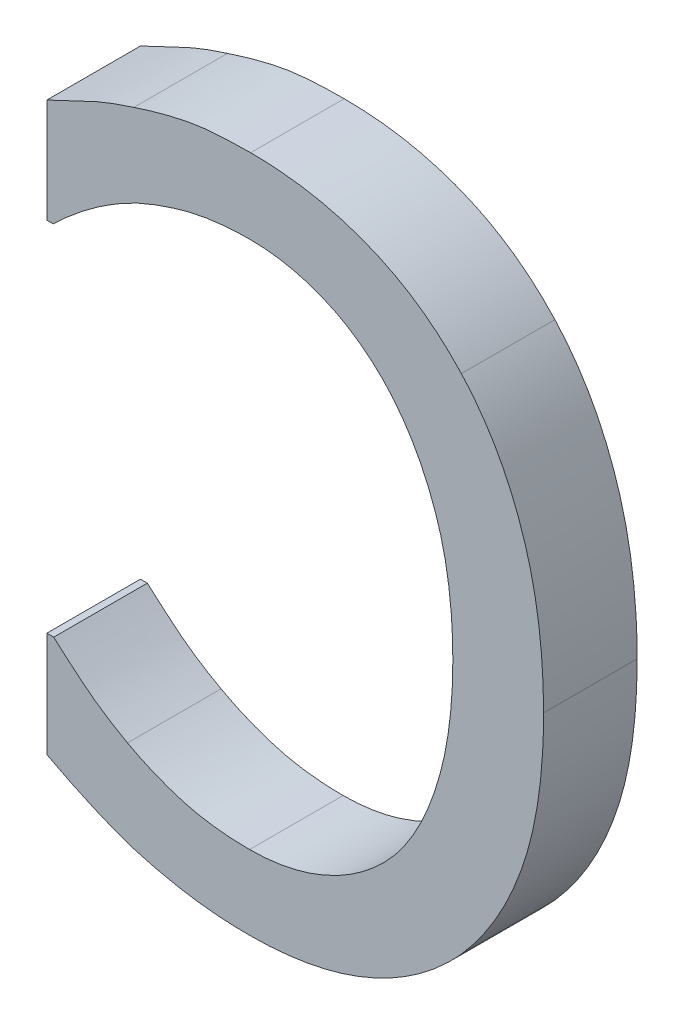
ISO-10303-21;
HEADER;
FILE_DESCRIPTION(('STEP AP214'),'2;1');
FILE_NAME('part.step','',(''),(''),'','','');
FILE_SCHEMA(('AUTOMOTIVE_DESIGN { 1 0 10303 214 1 1 1 1 }'));
ENDSEC;
DATA;
#1=APPLICATION_CONTEXT('core data for automotive mechanical design processes');
#2=APPLICATION_PROTOCOL_DEFINITION('international standard','automotive_design',2000,#1);
#3=PRODUCT_CONTEXT('',#1,'mechanical');
#4=PRODUCT('Part','Part','',(#3));
#5=PRODUCT_RELATED_PRODUCT_CATEGORY('part','',(#4));
#6=PRODUCT_DEFINITION_FORMATION('','',#4);
#7=PRODUCT_DEFINITION_CONTEXT('part definition',#1,'design');
#8=PRODUCT_DEFINITION('design','',#6,#7);
#9=PRODUCT_DEFINITION_SHAPE('','',#8);
#10=(LENGTH_UNIT() NAMED_UNIT(*) SI_UNIT(.MILLI.,.METRE.));
#11=(NAMED_UNIT(*) PLANE_ANGLE_UNIT() SI_UNIT($,.RADIAN.));
#12=(NAMED_UNIT(*) SI_UNIT($,.STERADIAN.) SOLID_ANGLE_UNIT());
#13=UNCERTAINTY_MEASURE_WITH_UNIT(LENGTH_MEASURE(1.E-05),#10,'distance_accuracy_value','');
#14=(GEOMETRIC_REPRESENTATION_CONTEXT(3) GLOBAL_UNCERTAINTY_ASSIGNED_CONTEXT((#13)) GLOBAL_UNIT_ASSIGNED_CONTEXT((#10,
#11,#12)) REPRESENTATION_CONTEXT('',''));
#15=CARTESIAN_POINT('',(0.,0.,0.));
#16=DIRECTION('',(0.,0.,1.));
#17=DIRECTION('',(1.,0.,0.));
#18=AXIS2_PLACEMENT_3D('',#15,#16,#17);
#19=CARTESIAN_POINT('',(1.253187687147,0.93501124365464,0.));
#20=CARTESIAN_POINT('',(1.253187687147,0.93501124365464,0.1));
#21=CARTESIAN_POINT('',(1.253187687147,1.023483728328,0.));
#22=CARTESIAN_POINT('',(1.253187687147,1.023483728328,0.1));
#23=CARTESIAN_POINT('',(1.207250050874,1.159595243209,0.));
#24=CARTESIAN_POINT('',(1.207250050874,1.159595243209,0.1));
#25=CARTESIAN_POINT('',(1.165282333786,1.204965748169,0.));
#26=CARTESIAN_POINT('',(1.165282333786,1.204965748169,0.1));
#27=B_SPLINE_SURFACE_WITH_KNOTS('',2,1,((#19,#20),(#21,#22),(#23,#24),(#25,#26)),.UNSPECIFIED.,
.F.,.F.,.F.,(3,1,3),(2,2),(-2.,-1.,0.),(0.,0.01),.UNSPECIFIED.);
#28=CARTESIAN_POINT('',(1.165282333786,1.204965748169,0.));
#29=CARTESIAN_POINT('',(1.207250050874,1.159595243209,0.));
#30=CARTESIAN_POINT('',(1.253187687147,1.023483728328,0.));
#31=CARTESIAN_POINT('',(1.253187687147,0.93501124365464,0.));
#32=B_SPLINE_CURVE_WITH_KNOTS('',2,(#28,#29,#30,#31),.UNSPECIFIED.,.F.,.F.,(3,1,3),(0.,1.,2.),.UNSPECIFIED.);
#33=CARTESIAN_POINT('',(1.165282333786,1.204965748169,0.));
#34=VERTEX_POINT('',#33);
#35=CARTESIAN_POINT('',(1.253187687147,0.93501124365464,0.));
#36=VERTEX_POINT('',#35);
#37=EDGE_CURVE('E11',#34,#36,#32,.T.);
#38=DIRECTION('',(0.,0.,1.));
#39=VECTOR('',#38,1.);
#40=CARTESIAN_POINT('',(1.165282333786,1.204965748169,0.));
#41=LINE('',#40,#39);
#42=CARTESIAN_POINT('',(1.165282333786,1.204965748169,0.1));
#43=VERTEX_POINT('',#42);
#44=EDGE_CURVE('E28',#34,#43,#41,.T.);
#45=CARTESIAN_POINT('',(1.253187687147,0.93501124365464,0.1));
#46=CARTESIAN_POINT('',(1.253187687147,1.023483728328,0.1));
#47=CARTESIAN_POINT('',(1.207250050874,1.159595243209,0.1));
#48=CARTESIAN_POINT('',(1.165282333786,1.204965748169,0.1));
#49=B_SPLINE_CURVE_WITH_KNOTS('',2,(#45,#46,#47,#48),.UNSPECIFIED.,.F.,.F.,(3,1,3),(-2.,-1.,0.),.UNSPECIFIED.);
#50=CARTESIAN_POINT('',(1.253187687147,0.93501124365464,0.1));
#51=VERTEX_POINT('',#50);
#52=EDGE_CURVE('E176',#51,#43,#49,.T.);
#53=DIRECTION('',(0.,0.,1.));
#54=VECTOR('',#53,1.);
#55=CARTESIAN_POINT('',(1.253187687147,0.93501124365464,0.));
#56=LINE('',#55,#54);
#57=EDGE_CURVE('E460',#36,#51,#56,.T.);
#58=ORIENTED_EDGE('',*,*,#37,.F.);
#59=ORIENTED_EDGE('',*,*,#44,.T.);
#60=ORIENTED_EDGE('',*,*,#52,.F.);
#61=ORIENTED_EDGE('',*,*,#57,.F.);
#62=EDGE_LOOP('',(#58,#59,#60,#61));
#63=FACE_BOUND('',#62,.T.);
#64=ADVANCED_FACE('F17',(#63),#27,.T.);
#65=CARTESIAN_POINT('',(1.165849465098,0.668459527012044,0.));
#66=CARTESIAN_POINT('',(1.165849465098,0.668459527012044,0.1));
#67=CARTESIAN_POINT('',(1.208384313498,0.716665688532513,0.));
#68=CARTESIAN_POINT('',(1.208384313498,0.716665688532513,0.1));
#69=CARTESIAN_POINT('',(1.253187687147,0.847105890293784,0.));
#70=CARTESIAN_POINT('',(1.253187687147,0.847105890293784,0.1));
#71=CARTESIAN_POINT('',(1.253187687147,0.93501124365464,0.));
#72=CARTESIAN_POINT('',(1.253187687147,0.93501124365464,0.1));
#73=B_SPLINE_SURFACE_WITH_KNOTS('',2,1,((#65,#66),(#67,#68),(#69,#70),(#71,#72)),.UNSPECIFIED.,
.F.,.F.,.F.,(3,1,3),(2,2),(-2.,-1.,0.),(0.,0.01),.UNSPECIFIED.);
#74=CARTESIAN_POINT('',(1.253187687147,0.93501124365464,0.));
#75=CARTESIAN_POINT('',(1.253187687147,0.847105890293784,0.));
#76=CARTESIAN_POINT('',(1.208384313498,0.716665688532513,0.));
#77=CARTESIAN_POINT('',(1.165849465098,0.668459527012044,0.));
#78=B_SPLINE_CURVE_WITH_KNOTS('',2,(#74,#75,#76,#77),.UNSPECIFIED.,.F.,.F.,(3,1,3),(0.,1.,2.),.UNSPECIFIED.);
#79=CARTESIAN_POINT('',(1.165849465098,0.668459527012044,0.));
#80=VERTEX_POINT('',#79);
#81=EDGE_CURVE('E453',#36,#80,#78,.T.);
#82=CARTESIAN_POINT('',(1.165849465098,0.668459527012044,0.1));
#83=CARTESIAN_POINT('',(1.208384313498,0.716665688532513,0.1));
#84=CARTESIAN_POINT('',(1.253187687147,0.847105890293784,0.1));
#85=CARTESIAN_POINT('',(1.253187687147,0.93501124365464,0.1));
#86=B_SPLINE_CURVE_WITH_KNOTS('',2,(#82,#83,#84,#85),.UNSPECIFIED.,.F.,.F.,(3,1,3),(-2.,-1.,0.),.UNSPECIFIED.);
#87=CARTESIAN_POINT('',(1.165849465098,0.668459527012044,0.1));
#88=VERTEX_POINT('',#87);
#89=EDGE_CURVE('E449',#88,#51,#86,.T.);
#90=DIRECTION('',(0.,0.,1.));
#91=VECTOR('',#90,1.);
#92=CARTESIAN_POINT('',(1.165849465098,0.668459527012044,0.));
#93=LINE('',#92,#91);
#94=EDGE_CURVE('E443',#80,#88,#93,.T.);
#95=ORIENTED_EDGE('',*,*,#81,.F.);
#96=ORIENTED_EDGE('',*,*,#57,.T.);
#97=ORIENTED_EDGE('',*,*,#89,.F.);
#98=ORIENTED_EDGE('',*,*,#94,.F.);
#99=EDGE_LOOP('',(#95,#96,#97,#98));
#100=FACE_BOUND('',#99,.T.);
#101=ADVANCED_FACE('F538',(#100),#73,.T.);
#102=CARTESIAN_POINT('',(0.938429808983811,0.572047203971105,0.));
#103=CARTESIAN_POINT('',(0.938429808983811,0.572047203971105,0.1));
#104=CARTESIAN_POINT('',(1.009321222985,0.572047203971105,0.));
#105=CARTESIAN_POINT('',(1.009321222985,0.572047203971105,0.1));
#106=CARTESIAN_POINT('',(1.12388174801,0.621387628115585,0.));
#107=CARTESIAN_POINT('',(1.12388174801,0.621387628115585,0.1));
#108=CARTESIAN_POINT('',(1.165849465098,0.668459527012044,0.));
#109=CARTESIAN_POINT('',(1.165849465098,0.668459527012044,0.1));
#110=B_SPLINE_SURFACE_WITH_KNOTS('',2,1,((#102,#103),(#104,#105),(#106,#107),(#108,#109)),
.UNSPECIFIED.,.F.,.F.,.F.,(3,1,3),(2,2),(-2.,-1.,0.),(0.,0.01),.UNSPECIFIED.);
#111=CARTESIAN_POINT('',(1.165849465098,0.668459527012044,0.));
#112=CARTESIAN_POINT('',(1.12388174801,0.621387628115585,0.));
#113=CARTESIAN_POINT('',(1.009321222985,0.572047203971105,0.));
#114=CARTESIAN_POINT('',(0.938429808983811,0.572047203971105,0.));
#115=B_SPLINE_CURVE_WITH_KNOTS('',2,(#111,#112,#113,#114),.UNSPECIFIED.,.F.,.F.,(3,1,3),(0.,1.,
2.),.UNSPECIFIED.);
#116=CARTESIAN_POINT('',(0.938429808983811,0.572047203971105,0.));
#117=VERTEX_POINT('',#116);
#118=EDGE_CURVE('E436',#80,#117,#115,.T.);
#119=CARTESIAN_POINT('',(0.938429808983811,0.572047203971105,0.1));
#120=CARTESIAN_POINT('',(1.009321222985,0.572047203971105,0.1));
#121=CARTESIAN_POINT('',(1.12388174801,0.621387628115585,0.1));
#122=CARTESIAN_POINT('',(1.165849465098,0.668459527012044,0.1));
#123=B_SPLINE_CURVE_WITH_KNOTS('',2,(#119,#120,#121,#122),.UNSPECIFIED.,.F.,.F.,(3,1,3),(-2.,
-1.,0.),.UNSPECIFIED.);
#124=CARTESIAN_POINT('',(0.938429808983811,0.572047203971105,0.1));
#125=VERTEX_POINT('',#124);
#126=EDGE_CURVE('E431',#125,#88,#123,.T.);
#127=DIRECTION('',(0.,0.,1.));
#128=VECTOR('',#127,1.);
#129=CARTESIAN_POINT('',(0.938429808983811,0.572047203971105,0.));
#130=LINE('',#129,#128);
#131=EDGE_CURVE('E425',#117,#125,#130,.T.);
#132=ORIENTED_EDGE('',*,*,#118,.F.);
#133=ORIENTED_EDGE('',*,*,#94,.T.);
#134=ORIENTED_EDGE('',*,*,#126,.F.);
#135=ORIENTED_EDGE('',*,*,#131,.F.);
#136=EDGE_LOOP('',(#132,#133,#134,#135));
#137=FACE_BOUND('',#136,.T.);
#138=ADVANCED_FACE('F534',(#137),#110,.T.);
#139=CARTESIAN_POINT('',(0.815362314278612,0.590195405955281,0.));
#140=CARTESIAN_POINT('',(0.815362314278612,0.590195405955281,0.1));
#141=CARTESIAN_POINT('',(0.841450354630866,0.582255567587204,0.));
#142=CARTESIAN_POINT('',(0.841450354630866,0.582255567587204,0.1));
#143=CARTESIAN_POINT('',(0.903267667639468,0.572047203971105,0.));
#144=CARTESIAN_POINT('',(0.903267667639468,0.572047203971105,0.1));
#145=CARTESIAN_POINT('',(0.938429808983811,0.572047203971105,0.));
#146=CARTESIAN_POINT('',(0.938429808983811,0.572047203971105,0.1));
#147=B_SPLINE_SURFACE_WITH_KNOTS('',2,1,((#139,#140),(#141,#142),(#143,#144),(#145,#146)),
.UNSPECIFIED.,.F.,.F.,.F.,(3,1,3),(2,2),(-2.,-1.,0.),(0.,0.01),.UNSPECIFIED.);
#148=CARTESIAN_POINT('',(0.938429808983811,0.572047203971105,0.));
#149=CARTESIAN_POINT('',(0.903267667639468,0.572047203971105,0.));
#150=CARTESIAN_POINT('',(0.841450354630866,0.582255567587204,0.));
#151=CARTESIAN_POINT('',(0.815362314278612,0.590195405955281,0.));
#152=B_SPLINE_CURVE_WITH_KNOTS('',2,(#148,#149,#150,#151),.UNSPECIFIED.,.F.,.F.,(3,1,3),(0.,1.,
2.),.UNSPECIFIED.);
#153=CARTESIAN_POINT('',(0.815362314278612,0.590195405955281,0.));
#154=VERTEX_POINT('',#153);
#155=EDGE_CURVE('E418',#117,#154,#152,.T.);
#156=CARTESIAN_POINT('',(0.815362314278612,0.590195405955281,0.1));
#157=CARTESIAN_POINT('',(0.841450354630866,0.582255567587204,0.1));
#158=CARTESIAN_POINT('',(0.903267667639468,0.572047203971105,0.1));
#159=CARTESIAN_POINT('',(0.938429808983811,0.572047203971105,0.1));
#160=B_SPLINE_CURVE_WITH_KNOTS('',2,(#156,#157,#158,#159),.UNSPECIFIED.,.F.,.F.,(3,1,3),(-2.,
-1.,0.),.UNSPECIFIED.);
#161=CARTESIAN_POINT('',(0.815362314278612,0.590195405955281,0.1));
#162=VERTEX_POINT('',#161);
#163=EDGE_CURVE('E413',#162,#125,#160,.T.);
#164=DIRECTION('',(0.,0.,1.));
#165=VECTOR('',#164,1.);
#166=CARTESIAN_POINT('',(0.815362314278612,0.590195405955281,0.));
#167=LINE('',#166,#165);
#168=EDGE_CURVE('E407',#154,#162,#167,.T.);
#169=ORIENTED_EDGE('',*,*,#155,.F.);
#170=ORIENTED_EDGE('',*,*,#131,.T.);
#171=ORIENTED_EDGE('',*,*,#163,.F.);
#172=ORIENTED_EDGE('',*,*,#168,.F.);
#173=EDGE_LOOP('',(#169,#170,#171,#172));
#174=FACE_BOUND('',#173,.T.);
#175=ADVANCED_FACE('F530',(#174),#147,.T.);
#176=CARTESIAN_POINT('',(0.722352779109706,0.631028860419679,0.));
#177=CARTESIAN_POINT('',(0.722352779109706,0.631028860419679,0.1));
#178=CARTESIAN_POINT('',(0.745605162901933,0.618551971555557,0.));
#179=CARTESIAN_POINT('',(0.745605162901933,0.618551971555557,0.1));
#180=CARTESIAN_POINT('',(0.792677061798391,0.597568113011353,0.));
#181=CARTESIAN_POINT('',(0.792677061798391,0.597568113011353,0.1));
#182=CARTESIAN_POINT('',(0.815362314278612,0.590195405955281,0.));
#183=CARTESIAN_POINT('',(0.815362314278612,0.590195405955281,0.1));
#184=B_SPLINE_SURFACE_WITH_KNOTS('',2,1,((#176,#177),(#178,#179),(#180,#181),(#182,#183)),
.UNSPECIFIED.,.F.,.F.,.F.,(3,1,3),(2,2),(-2.,-1.,0.),(0.,0.01),.UNSPECIFIED.);
#185=CARTESIAN_POINT('',(0.815362314278612,0.590195405955281,0.));
#186=CARTESIAN_POINT('',(0.792677061798391,0.597568113011353,0.));
#187=CARTESIAN_POINT('',(0.745605162901933,0.618551971555557,0.));
#188=CARTESIAN_POINT('',(0.722352779109706,0.631028860419679,0.));
#189=B_SPLINE_CURVE_WITH_KNOTS('',2,(#185,#186,#187,#188),.UNSPECIFIED.,.F.,.F.,(3,1,3),(0.,1.,
2.),.UNSPECIFIED.);
#190=CARTESIAN_POINT('',(0.722352779109706,0.631028860419679,0.));
#191=VERTEX_POINT('',#190);
#192=EDGE_CURVE('E400',#154,#191,#189,.T.);
#193=CARTESIAN_POINT('',(0.722352779109706,0.631028860419679,0.1));
#194=CARTESIAN_POINT('',(0.745605162901933,0.618551971555557,0.1));
#195=CARTESIAN_POINT('',(0.792677061798391,0.597568113011353,0.1));
#196=CARTESIAN_POINT('',(0.815362314278612,0.590195405955281,0.1));
#197=B_SPLINE_CURVE_WITH_KNOTS('',2,(#193,#194,#195,#196),.UNSPECIFIED.,.F.,.F.,(3,1,3),(-2.,
-1.,0.),.UNSPECIFIED.);
#198=CARTESIAN_POINT('',(0.722352779109706,0.631028860419679,0.1));
#199=VERTEX_POINT('',#198);
#200=EDGE_CURVE('E395',#199,#162,#197,.T.);
#201=DIRECTION('',(0.,0.,1.));
#202=VECTOR('',#201,1.);
#203=CARTESIAN_POINT('',(0.722352779109706,0.631028860419679,0.));
#204=LINE('',#203,#202);
#205=EDGE_CURVE('E392',#191,#199,#204,.T.);
#206=ORIENTED_EDGE('',*,*,#192,.F.);
#207=ORIENTED_EDGE('',*,*,#168,.T.);
#208=ORIENTED_EDGE('',*,*,#200,.F.);
#209=ORIENTED_EDGE('',*,*,#205,.F.);
#210=EDGE_LOOP('',(#206,#207,#208,#209));
#211=FACE_BOUND('',#210,.T.);
#212=ADVANCED_FACE('F526',(#211),#184,.T.);
#213=CARTESIAN_POINT('',(0.722352779109706,0.743320860196773,0.));
#214=DIRECTION('',(-1.,0.,0.));
#215=DIRECTION('',(0.,-1.,0.));
#216=AXIS2_PLACEMENT_3D('',#213,#214,#215);
#217=PLANE('',#216);
#218=DIRECTION('',(0.,1.,0.));
#219=VECTOR('',#218,1.);
#220=CARTESIAN_POINT('',(0.722352779109706,0.631028860419679,0.));
#221=LINE('',#220,#219);
#222=CARTESIAN_POINT('',(0.722352779109706,0.743320860196773,0.));
#223=VERTEX_POINT('',#222);
#224=EDGE_CURVE('E390',#191,#223,#221,.T.);
#225=ORIENTED_EDGE('',*,*,#224,.F.);
#226=ORIENTED_EDGE('',*,*,#205,.T.);
#227=DIRECTION('',(0.,-1.,0.));
#228=VECTOR('',#227,1.);
#229=CARTESIAN_POINT('',(0.722352779109706,0.631028860419679,0.1));
#230=LINE('',#229,#228);
#231=CARTESIAN_POINT('',(0.722352779109706,0.743320860196773,0.1));
#232=VERTEX_POINT('',#231);
#233=EDGE_CURVE('E387',#232,#199,#230,.T.);
#234=ORIENTED_EDGE('',*,*,#233,.F.);
#235=DIRECTION('',(0.,0.,1.));
#236=VECTOR('',#235,1.);
#237=CARTESIAN_POINT('',(0.722352779109706,0.743320860196773,0.));
#238=LINE('',#237,#236);
#239=EDGE_CURVE('E384',#223,#232,#238,.T.);
#240=ORIENTED_EDGE('',*,*,#239,.F.);
#241=EDGE_LOOP('',(#225,#226,#234,#240));
#242=FACE_BOUND('',#241,.T.);
#243=ADVANCED_FACE('F522',(#242),#217,.T.);
#244=CARTESIAN_POINT('',(0.729725486165778,0.743320860196773,0.));
#245=DIRECTION('',(0.,1.,0.));
#246=DIRECTION('',(-1.,0.,0.));
#247=AXIS2_PLACEMENT_3D('',#244,#245,#246);
#248=PLANE('',#247);
#249=DIRECTION('',(1.,0.,0.));
#250=VECTOR('',#249,1.);
#251=CARTESIAN_POINT('',(0.722352779109706,0.743320860196773,0.));
#252=LINE('',#251,#250);
#253=CARTESIAN_POINT('',(0.729725486165778,0.743320860196773,0.));
#254=VERTEX_POINT('',#253);
#255=EDGE_CURVE('E382',#223,#254,#252,.T.);
#256=ORIENTED_EDGE('',*,*,#255,.F.);
#257=ORIENTED_EDGE('',*,*,#239,.T.);
#258=DIRECTION('',(-1.,0.,0.));
#259=VECTOR('',#258,1.);
#260=CARTESIAN_POINT('',(0.722352779109706,0.743320860196773,0.1));
#261=LINE('',#260,#259);
#262=CARTESIAN_POINT('',(0.729725486165778,0.743320860196773,0.1));
#263=VERTEX_POINT('',#262);
#264=EDGE_CURVE('E379',#263,#232,#261,.T.);
#265=ORIENTED_EDGE('',*,*,#264,.F.);
#266=DIRECTION('',(0.,0.,1.));
#267=VECTOR('',#266,1.);
#268=CARTESIAN_POINT('',(0.729725486165778,0.743320860196773,0.));
#269=LINE('',#268,#267);
#270=EDGE_CURVE('E373',#254,#263,#269,.T.);
#271=ORIENTED_EDGE('',*,*,#270,.F.);
#272=EDGE_LOOP('',(#256,#257,#265,#271));
#273=FACE_BOUND('',#272,.T.);
#274=ADVANCED_FACE('F518',(#273),#248,.T.);
#275=CARTESIAN_POINT('',(0.808556738534546,0.684906335060204,0.));
#276=CARTESIAN_POINT('',(0.808556738534546,0.684906335060204,0.1));
#277=CARTESIAN_POINT('',(0.780767304246275,0.700218880484353,0.));
#278=CARTESIAN_POINT('',(0.780767304246275,0.700218880484353,0.1));
#279=CARTESIAN_POINT('',(0.7422023750299,0.731978233956662,0.));
#280=CARTESIAN_POINT('',(0.7422023750299,0.731978233956662,0.1));
#281=CARTESIAN_POINT('',(0.729725486165778,0.743320860196773,0.));
#282=CARTESIAN_POINT('',(0.729725486165778,0.743320860196773,0.1));
#283=B_SPLINE_SURFACE_WITH_KNOTS('',2,1,((#275,#276),(#277,#278),(#279,#280),(#281,#282)),
.UNSPECIFIED.,.F.,.F.,.F.,(3,1,3),(2,2),(-2.,-1.,0.),(0.,0.01),.UNSPECIFIED.);
#284=CARTESIAN_POINT('',(0.729725486165778,0.743320860196773,0.));
#285=CARTESIAN_POINT('',(0.7422023750299,0.731978233956662,0.));
#286=CARTESIAN_POINT('',(0.780767304246275,0.700218880484353,0.));
#287=CARTESIAN_POINT('',(0.808556738534546,0.684906335060204,0.));
#288=B_SPLINE_CURVE_WITH_KNOTS('',2,(#284,#285,#286,#287),.UNSPECIFIED.,.F.,.F.,(3,1,3),(0.,1.,
2.),.UNSPECIFIED.);
#289=CARTESIAN_POINT('',(0.808556738534546,0.684906335060204,0.));
#290=VERTEX_POINT('',#289);
#291=EDGE_CURVE('E366',#254,#290,#288,.T.);
#292=CARTESIAN_POINT('',(0.808556738534546,0.684906335060204,0.1));
#293=CARTESIAN_POINT('',(0.780767304246275,0.700218880484353,0.1));
#294=CARTESIAN_POINT('',(0.7422023750299,0.731978233956662,0.1));
#295=CARTESIAN_POINT('',(0.729725486165778,0.743320860196773,0.1));
#296=B_SPLINE_CURVE_WITH_KNOTS('',2,(#292,#293,#294,#295),.UNSPECIFIED.,.F.,.F.,(3,1,3),(-2.,
-1.,0.),.UNSPECIFIED.);
#297=CARTESIAN_POINT('',(0.808556738534546,0.684906335060204,0.1));
#298=VERTEX_POINT('',#297);
#299=EDGE_CURVE('E361',#298,#263,#296,.T.);
#300=DIRECTION('',(0.,0.,1.));
#301=VECTOR('',#300,1.);
#302=CARTESIAN_POINT('',(0.808556738534546,0.684906335060204,0.));
#303=LINE('',#302,#301);
#304=EDGE_CURVE('E355',#290,#298,#303,.T.);
#305=ORIENTED_EDGE('',*,*,#291,.F.);
#306=ORIENTED_EDGE('',*,*,#270,.T.);
#307=ORIENTED_EDGE('',*,*,#299,.F.);
#308=ORIENTED_EDGE('',*,*,#304,.F.);
#309=EDGE_LOOP('',(#305,#306,#307,#308));
#310=FACE_BOUND('',#309,.T.);
#311=ADVANCED_FACE('F514',(#310),#283,.T.);
#312=CARTESIAN_POINT('',(0.938996940295816,0.651445587651878,0.));
#313=CARTESIAN_POINT('',(0.938996940295816,0.651445587651878,0.1));
#314=CARTESIAN_POINT('',(0.898163485831419,0.651445587651878,0.));
#315=CARTESIAN_POINT('',(0.898163485831419,0.651445587651878,0.1));
#316=CARTESIAN_POINT('',(0.835211910198806,0.67016092094806,0.));
#317=CARTESIAN_POINT('',(0.835211910198806,0.67016092094806,0.1));
#318=CARTESIAN_POINT('',(0.808556738534546,0.684906335060204,0.));
#319=CARTESIAN_POINT('',(0.808556738534546,0.684906335060204,0.1));
#320=B_SPLINE_SURFACE_WITH_KNOTS('',2,1,((#312,#313),(#314,#315),(#316,#317),(#318,#319)),
.UNSPECIFIED.,.F.,.F.,.F.,(3,1,3),(2,2),(-2.,-1.,0.),(0.,0.01),.UNSPECIFIED.);
#321=CARTESIAN_POINT('',(0.808556738534546,0.684906335060204,0.));
#322=CARTESIAN_POINT('',(0.835211910198806,0.67016092094806,0.));
#323=CARTESIAN_POINT('',(0.898163485831419,0.651445587651878,0.));
#324=CARTESIAN_POINT('',(0.938996940295816,0.651445587651878,0.));
#325=B_SPLINE_CURVE_WITH_KNOTS('',2,(#321,#322,#323,#324),.UNSPECIFIED.,.F.,.F.,(3,1,3),(0.,1.,
2.),.UNSPECIFIED.);
#326=CARTESIAN_POINT('',(0.938996940295816,0.651445587651878,0.));
#327=VERTEX_POINT('',#326);
#328=EDGE_CURVE('E348',#290,#327,#325,.T.);
#329=CARTESIAN_POINT('',(0.938996940295816,0.651445587651878,0.1));
#330=CARTESIAN_POINT('',(0.898163485831419,0.651445587651878,0.1));
#331=CARTESIAN_POINT('',(0.835211910198806,0.67016092094806,0.1));
#332=CARTESIAN_POINT('',(0.808556738534546,0.684906335060204,0.1));
#333=B_SPLINE_CURVE_WITH_KNOTS('',2,(#329,#330,#331,#332),.UNSPECIFIED.,.F.,.F.,(3,1,3),(-2.,
-1.,0.),.UNSPECIFIED.);
#334=CARTESIAN_POINT('',(0.938996940295816,0.651445587651878,0.1));
#335=VERTEX_POINT('',#334);
#336=EDGE_CURVE('E343',#335,#298,#333,.T.);
#337=DIRECTION('',(0.,0.,1.));
#338=VECTOR('',#337,1.);
#339=CARTESIAN_POINT('',(0.938996940295816,0.651445587651878,0.));
#340=LINE('',#339,#338);
#341=EDGE_CURVE('E337',#327,#335,#340,.T.);
#342=ORIENTED_EDGE('',*,*,#328,.F.);
#343=ORIENTED_EDGE('',*,*,#304,.T.);
#344=ORIENTED_EDGE('',*,*,#336,.F.);
#345=ORIENTED_EDGE('',*,*,#341,.F.);
#346=EDGE_LOOP('',(#342,#343,#344,#345));
#347=FACE_BOUND('',#346,.T.);
#348=ADVANCED_FACE('F510',(#347),#320,.T.);
#349=CARTESIAN_POINT('',(1.093823788473,0.723471264276579,0.));
#350=CARTESIAN_POINT('',(1.093823788473,0.723471264276579,0.1));
#351=CARTESIAN_POINT('',(1.063765828937,0.688309122932237,0.));
#352=CARTESIAN_POINT('',(1.063765828937,0.688309122932237,0.1));
#353=CARTESIAN_POINT('',(0.983800313944253,0.651445587651878,0.));
#354=CARTESIAN_POINT('',(0.983800313944253,0.651445587651878,0.1));
#355=CARTESIAN_POINT('',(0.938996940295816,0.651445587651878,0.));
#356=CARTESIAN_POINT('',(0.938996940295816,0.651445587651878,0.1));
#357=B_SPLINE_SURFACE_WITH_KNOTS('',2,1,((#349,#350),(#351,#352),(#353,#354),(#355,#356)),
.UNSPECIFIED.,.F.,.F.,.F.,(3,1,3),(2,2),(-2.,-1.,0.),(0.,0.01),.UNSPECIFIED.);
#358=CARTESIAN_POINT('',(0.938996940295816,0.651445587651878,0.));
#359=CARTESIAN_POINT('',(0.983800313944253,0.651445587651878,0.));
#360=CARTESIAN_POINT('',(1.063765828937,0.688309122932237,0.));
#361=CARTESIAN_POINT('',(1.093823788473,0.723471264276579,0.));
#362=B_SPLINE_CURVE_WITH_KNOTS('',2,(#358,#359,#360,#361),.UNSPECIFIED.,.F.,.F.,(3,1,3),(0.,1.,
2.),.UNSPECIFIED.);
#363=CARTESIAN_POINT('',(1.093823788473,0.723471264276579,0.));
#364=VERTEX_POINT('',#363);
#365=EDGE_CURVE('E330',#327,#364,#362,.T.);
#366=CARTESIAN_POINT('',(1.093823788473,0.723471264276579,0.1));
#367=CARTESIAN_POINT('',(1.063765828937,0.688309122932237,0.1));
#368=CARTESIAN_POINT('',(0.983800313944253,0.651445587651878,0.1));
#369=CARTESIAN_POINT('',(0.938996940295816,0.651445587651878,0.1));
#370=B_SPLINE_CURVE_WITH_KNOTS('',2,(#366,#367,#368,#369),.UNSPECIFIED.,.F.,.F.,(3,1,3),(-2.,
-1.,0.),.UNSPECIFIED.);
#371=CARTESIAN_POINT('',(1.093823788473,0.723471264276579,0.1));
#372=VERTEX_POINT('',#371);
#373=EDGE_CURVE('E325',#372,#335,#370,.T.);
#374=DIRECTION('',(0.,0.,1.));
#375=VECTOR('',#374,1.);
#376=CARTESIAN_POINT('',(1.093823788473,0.723471264276579,0.));
#377=LINE('',#376,#375);
#378=EDGE_CURVE('E319',#364,#372,#377,.T.);
#379=ORIENTED_EDGE('',*,*,#365,.F.);
#380=ORIENTED_EDGE('',*,*,#341,.T.);
#381=ORIENTED_EDGE('',*,*,#373,.F.);
#382=ORIENTED_EDGE('',*,*,#378,.F.);
#383=EDGE_LOOP('',(#379,#380,#381,#382));
#384=FACE_BOUND('',#383,.T.);
#385=ADVANCED_FACE('F506',(#384),#357,.T.);
#386=CARTESIAN_POINT('',(1.156208232794,0.93501124365464,0.));
#387=CARTESIAN_POINT('',(1.156208232794,0.93501124365464,0.1));
#388=CARTESIAN_POINT('',(1.156208232794,0.867522617525982,0.));
#389=CARTESIAN_POINT('',(1.156208232794,0.867522617525982,0.1));
#390=CARTESIAN_POINT('',(1.123314616698,0.759200536932927,0.));
#391=CARTESIAN_POINT('',(1.123314616698,0.759200536932927,0.1));
#392=CARTESIAN_POINT('',(1.093823788473,0.723471264276579,0.));
#393=CARTESIAN_POINT('',(1.093823788473,0.723471264276579,0.1));
#394=B_SPLINE_SURFACE_WITH_KNOTS('',2,1,((#386,#387),(#388,#389),(#390,#391),(#392,#393)),
.UNSPECIFIED.,.F.,.F.,.F.,(3,1,3),(2,2),(-2.,-1.,0.),(0.,0.01),.UNSPECIFIED.);
#395=CARTESIAN_POINT('',(1.093823788473,0.723471264276579,0.));
#396=CARTESIAN_POINT('',(1.123314616698,0.759200536932927,0.));
#397=CARTESIAN_POINT('',(1.156208232794,0.867522617525982,0.));
#398=CARTESIAN_POINT('',(1.156208232794,0.93501124365464,0.));
#399=B_SPLINE_CURVE_WITH_KNOTS('',2,(#395,#396,#397,#398),.UNSPECIFIED.,.F.,.F.,(3,1,3),(0.,1.,
2.),.UNSPECIFIED.);
#400=CARTESIAN_POINT('',(1.156208232794,0.93501124365464,0.));
#401=VERTEX_POINT('',#400);
#402=EDGE_CURVE('E312',#364,#401,#399,.T.);
#403=CARTESIAN_POINT('',(1.156208232794,0.93501124365464,0.1));
#404=CARTESIAN_POINT('',(1.156208232794,0.867522617525982,0.1));
#405=CARTESIAN_POINT('',(1.123314616698,0.759200536932927,0.1));
#406=CARTESIAN_POINT('',(1.093823788473,0.723471264276579,0.1));
#407=B_SPLINE_CURVE_WITH_KNOTS('',2,(#403,#404,#405,#406),.UNSPECIFIED.,.F.,.F.,(3,1,3),(-2.,
-1.,0.),.UNSPECIFIED.);
#408=CARTESIAN_POINT('',(1.156208232794,0.93501124365464,0.1));
#409=VERTEX_POINT('',#408);
#410=EDGE_CURVE('E307',#409,#372,#407,.T.);
#411=DIRECTION('',(0.,0.,1.));
#412=VECTOR('',#411,1.);
#413=CARTESIAN_POINT('',(1.156208232794,0.93501124365464,0.));
#414=LINE('',#413,#412);
#415=EDGE_CURVE('E301',#401,#409,#414,.T.);
#416=ORIENTED_EDGE('',*,*,#402,.F.);
#417=ORIENTED_EDGE('',*,*,#378,.T.);
#418=ORIENTED_EDGE('',*,*,#410,.F.);
#419=ORIENTED_EDGE('',*,*,#415,.F.);
#420=EDGE_LOOP('',(#416,#417,#418,#419));
#421=FACE_BOUND('',#420,.T.);
#422=ADVANCED_FACE('F502',(#421),#394,.T.);
#423=CARTESIAN_POINT('',(1.091555263225,1.146551223033,0.));
#424=CARTESIAN_POINT('',(1.091555263225,1.146551223033,0.1));
#425=CARTESIAN_POINT('',(1.121613222762,1.110821950376,0.));
#426=CARTESIAN_POINT('',(1.121613222762,1.110821950376,0.1));
#427=CARTESIAN_POINT('',(1.156208232794,1.007036920279,0.));
#428=CARTESIAN_POINT('',(1.156208232794,1.007036920279,0.1));
#429=CARTESIAN_POINT('',(1.156208232794,0.93501124365464,0.));
#430=CARTESIAN_POINT('',(1.156208232794,0.93501124365464,0.1));
#431=B_SPLINE_SURFACE_WITH_KNOTS('',2,1,((#423,#424),(#425,#426),(#427,#428),(#429,#430)),
.UNSPECIFIED.,.F.,.F.,.F.,(3,1,3),(2,2),(-2.,-1.,0.),(0.,0.01),.UNSPECIFIED.);
#432=CARTESIAN_POINT('',(1.156208232794,0.93501124365464,0.));
#433=CARTESIAN_POINT('',(1.156208232794,1.007036920279,0.));
#434=CARTESIAN_POINT('',(1.121613222762,1.110821950376,0.));
#435=CARTESIAN_POINT('',(1.091555263225,1.146551223033,0.));
#436=B_SPLINE_CURVE_WITH_KNOTS('',2,(#432,#433,#434,#435),.UNSPECIFIED.,.F.,.F.,(3,1,3),(0.,1.,
2.),.UNSPECIFIED.);
#437=CARTESIAN_POINT('',(1.091555263225,1.146551223033,0.));
#438=VERTEX_POINT('',#437);
#439=EDGE_CURVE('E294',#401,#438,#436,.T.);
#440=CARTESIAN_POINT('',(1.091555263225,1.146551223033,0.1));
#441=CARTESIAN_POINT('',(1.121613222762,1.110821950376,0.1));
#442=CARTESIAN_POINT('',(1.156208232794,1.007036920279,0.1));
#443=CARTESIAN_POINT('',(1.156208232794,0.93501124365464,0.1));
#444=B_SPLINE_CURVE_WITH_KNOTS('',2,(#440,#441,#442,#443),.UNSPECIFIED.,.F.,.F.,(3,1,3),(-2.,
-1.,0.),.UNSPECIFIED.);
#445=CARTESIAN_POINT('',(1.091555263225,1.146551223033,0.1));
#446=VERTEX_POINT('',#445);
#447=EDGE_CURVE('E289',#446,#409,#444,.T.);
#448=DIRECTION('',(0.,0.,1.));
#449=VECTOR('',#448,1.);
#450=CARTESIAN_POINT('',(1.091555263225,1.146551223033,0.));
#451=LINE('',#450,#449);
#452=EDGE_CURVE('E283',#438,#446,#451,.T.);
#453=ORIENTED_EDGE('',*,*,#439,.F.);
#454=ORIENTED_EDGE('',*,*,#415,.T.);
#455=ORIENTED_EDGE('',*,*,#447,.F.);
#456=ORIENTED_EDGE('',*,*,#452,.F.);
#457=EDGE_LOOP('',(#453,#454,#455,#456));
#458=FACE_BOUND('',#457,.T.);
#459=ADVANCED_FACE('F498',(#458),#431,.T.);
#460=CARTESIAN_POINT('',(0.938996940295816,1.216308374409,0.));
#461=CARTESIAN_POINT('',(0.938996940295816,1.216308374409,0.1));
#462=CARTESIAN_POINT('',(0.983233182632247,1.216308374409,0.));
#463=CARTESIAN_POINT('',(0.983233182632247,1.216308374409,0.1));
#464=CARTESIAN_POINT('',(1.062064435001,1.181146233065,0.));
#465=CARTESIAN_POINT('',(1.062064435001,1.181146233065,0.1));
#466=CARTESIAN_POINT('',(1.091555263225,1.146551223033,0.));
#467=CARTESIAN_POINT('',(1.091555263225,1.146551223033,0.1));
#468=B_SPLINE_SURFACE_WITH_KNOTS('',2,1,((#460,#461),(#462,#463),(#464,#465),(#466,#467)),
.UNSPECIFIED.,.F.,.F.,.F.,(3,1,3),(2,2),(-2.,-1.,0.),(0.,0.01),.UNSPECIFIED.);
#469=CARTESIAN_POINT('',(1.091555263225,1.146551223033,0.));
#470=CARTESIAN_POINT('',(1.062064435001,1.181146233065,0.));
#471=CARTESIAN_POINT('',(0.983233182632247,1.216308374409,0.));
#472=CARTESIAN_POINT('',(0.938996940295816,1.216308374409,0.));
#473=B_SPLINE_CURVE_WITH_KNOTS('',2,(#469,#470,#471,#472),.UNSPECIFIED.,.F.,.F.,(3,1,3),(0.,1.,
2.),.UNSPECIFIED.);
#474=CARTESIAN_POINT('',(0.938996940295816,1.216308374409,0.));
#475=VERTEX_POINT('',#474);
#476=EDGE_CURVE('E276',#438,#475,#473,.T.);
#477=CARTESIAN_POINT('',(0.938996940295816,1.216308374409,0.1));
#478=CARTESIAN_POINT('',(0.983233182632247,1.216308374409,0.1));
#479=CARTESIAN_POINT('',(1.062064435001,1.181146233065,0.1));
#480=CARTESIAN_POINT('',(1.091555263225,1.146551223033,0.1));
#481=B_SPLINE_CURVE_WITH_KNOTS('',2,(#477,#478,#479,#480),.UNSPECIFIED.,.F.,.F.,(3,1,3),(-2.,
-1.,0.),.UNSPECIFIED.);
#482=CARTESIAN_POINT('',(0.938996940295816,1.216308374409,0.1));
#483=VERTEX_POINT('',#482);
#484=EDGE_CURVE('E271',#483,#446,#481,.T.);
#485=DIRECTION('',(0.,0.,1.));
#486=VECTOR('',#485,1.);
#487=CARTESIAN_POINT('',(0.938996940295816,1.216308374409,0.));
#488=LINE('',#487,#486);
#489=EDGE_CURVE('E265',#475,#483,#488,.T.);
#490=ORIENTED_EDGE('',*,*,#476,.F.);
#491=ORIENTED_EDGE('',*,*,#452,.T.);
#492=ORIENTED_EDGE('',*,*,#484,.F.);
#493=ORIENTED_EDGE('',*,*,#489,.F.);
#494=EDGE_LOOP('',(#490,#491,#492,#493));
#495=FACE_BOUND('',#494,.T.);
#496=ADVANCED_FACE('F494',(#495),#468,.T.);
#497=CARTESIAN_POINT('',(0.803452556726496,1.181713364377,0.));
#498=CARTESIAN_POINT('',(0.803452556726496,1.181713364377,0.1));
#499=CARTESIAN_POINT('',(0.830107728390756,1.196458778489,0.));
#500=CARTESIAN_POINT('',(0.830107728390756,1.196458778489,0.1));
#501=CARTESIAN_POINT('',(0.898730617143424,1.216308374409,0.));
#502=CARTESIAN_POINT('',(0.898730617143424,1.216308374409,0.1));
#503=CARTESIAN_POINT('',(0.938996940295816,1.216308374409,0.));
#504=CARTESIAN_POINT('',(0.938996940295816,1.216308374409,0.1));
#505=B_SPLINE_SURFACE_WITH_KNOTS('',2,1,((#497,#498),(#499,#500),(#501,#502),(#503,#504)),
.UNSPECIFIED.,.F.,.F.,.F.,(3,1,3),(2,2),(-2.,-1.,0.),(0.,0.01),.UNSPECIFIED.);
#506=CARTESIAN_POINT('',(0.938996940295816,1.216308374409,0.));
#507=CARTESIAN_POINT('',(0.898730617143424,1.216308374409,0.));
#508=CARTESIAN_POINT('',(0.830107728390756,1.196458778489,0.));
#509=CARTESIAN_POINT('',(0.803452556726496,1.181713364377,0.));
#510=B_SPLINE_CURVE_WITH_KNOTS('',2,(#506,#507,#508,#509),.UNSPECIFIED.,.F.,.F.,(3,1,3),(0.,1.,
2.),.UNSPECIFIED.);
#511=CARTESIAN_POINT('',(0.803452556726496,1.181713364377,0.));
#512=VERTEX_POINT('',#511);
#513=EDGE_CURVE('E258',#475,#512,#510,.T.);
#514=CARTESIAN_POINT('',(0.803452556726496,1.181713364377,0.1));
#515=CARTESIAN_POINT('',(0.830107728390756,1.196458778489,0.1));
#516=CARTESIAN_POINT('',(0.898730617143424,1.216308374409,0.1));
#517=CARTESIAN_POINT('',(0.938996940295816,1.216308374409,0.1));
#518=B_SPLINE_CURVE_WITH_KNOTS('',2,(#514,#515,#516,#517),.UNSPECIFIED.,.F.,.F.,(3,1,3),(-2.,
-1.,0.),.UNSPECIFIED.);
#519=CARTESIAN_POINT('',(0.803452556726496,1.181713364377,0.1));
#520=VERTEX_POINT('',#519);
#521=EDGE_CURVE('E253',#520,#483,#518,.T.);
#522=DIRECTION('',(0.,0.,1.));
#523=VECTOR('',#522,1.);
#524=CARTESIAN_POINT('',(0.803452556726496,1.181713364377,0.));
#525=LINE('',#524,#523);
#526=EDGE_CURVE('E247',#512,#520,#525,.T.);
#527=ORIENTED_EDGE('',*,*,#513,.F.);
#528=ORIENTED_EDGE('',*,*,#489,.T.);
#529=ORIENTED_EDGE('',*,*,#521,.F.);
#530=ORIENTED_EDGE('',*,*,#526,.F.);
#531=EDGE_LOOP('',(#527,#528,#529,#530));
#532=FACE_BOUND('',#531,.T.);
#533=ADVANCED_FACE('F490',(#532),#505,.T.);
#534=CARTESIAN_POINT('',(0.729158354853773,1.125567364489,0.));
#535=CARTESIAN_POINT('',(0.729158354853773,1.125567364489,0.1));
#536=CARTESIAN_POINT('',(0.739933849781877,1.136342859417,0.));
#537=CARTESIAN_POINT('',(0.739933849781877,1.136342859417,0.1));
#538=CARTESIAN_POINT('',(0.777931647686248,1.166967950265,0.));
#539=CARTESIAN_POINT('',(0.777931647686248,1.166967950265,0.1));
#540=CARTESIAN_POINT('',(0.803452556726496,1.181713364377,0.));
#541=CARTESIAN_POINT('',(0.803452556726496,1.181713364377,0.1));
#542=B_SPLINE_SURFACE_WITH_KNOTS('',2,1,((#534,#535),(#536,#537),(#538,#539),(#540,#541)),
.UNSPECIFIED.,.F.,.F.,.F.,(3,1,3),(2,2),(-2.,-1.,0.),(0.,0.01),.UNSPECIFIED.);
#543=CARTESIAN_POINT('',(0.803452556726496,1.181713364377,0.));
#544=CARTESIAN_POINT('',(0.777931647686248,1.166967950265,0.));
#545=CARTESIAN_POINT('',(0.739933849781877,1.136342859417,0.));
#546=CARTESIAN_POINT('',(0.729158354853773,1.125567364489,0.));
#547=B_SPLINE_CURVE_WITH_KNOTS('',2,(#543,#544,#545,#546),.UNSPECIFIED.,.F.,.F.,(3,1,3),(0.,1.,
2.),.UNSPECIFIED.);
#548=CARTESIAN_POINT('',(0.729158354853773,1.125567364489,0.));
#549=VERTEX_POINT('',#548);
#550=EDGE_CURVE('E240',#512,#549,#547,.T.);
#551=CARTESIAN_POINT('',(0.729158354853773,1.125567364489,0.1));
#552=CARTESIAN_POINT('',(0.739933849781877,1.136342859417,0.1));
#553=CARTESIAN_POINT('',(0.777931647686248,1.166967950265,0.1));
#554=CARTESIAN_POINT('',(0.803452556726496,1.181713364377,0.1));
#555=B_SPLINE_CURVE_WITH_KNOTS('',2,(#551,#552,#553,#554),.UNSPECIFIED.,.F.,.F.,(3,1,3),(-2.,
-1.,0.),.UNSPECIFIED.);
#556=CARTESIAN_POINT('',(0.729158354853773,1.125567364489,0.1));
#557=VERTEX_POINT('',#556);
#558=EDGE_CURVE('E235',#557,#520,#555,.T.);
#559=DIRECTION('',(0.,0.,1.));
#560=VECTOR('',#559,1.);
#561=CARTESIAN_POINT('',(0.729158354853773,1.125567364489,0.));
#562=LINE('',#561,#560);
#563=EDGE_CURVE('E232',#549,#557,#562,.T.);
#564=ORIENTED_EDGE('',*,*,#550,.F.);
#565=ORIENTED_EDGE('',*,*,#526,.T.);
#566=ORIENTED_EDGE('',*,*,#558,.F.);
#567=ORIENTED_EDGE('',*,*,#563,.F.);
#568=EDGE_LOOP('',(#564,#565,#566,#567));
#569=FACE_BOUND('',#568,.T.);
#570=ADVANCED_FACE('F486',(#569),#542,.T.);
#571=CARTESIAN_POINT('',(0.722352779109706,1.125567364489,0.));
#572=DIRECTION('',(0.,-1.,0.));
#573=DIRECTION('',(1.,0.,0.));
#574=AXIS2_PLACEMENT_3D('',#571,#572,#573);
#575=PLANE('',#574);
#576=DIRECTION('',(-1.,0.,0.));
#577=VECTOR('',#576,1.);
#578=CARTESIAN_POINT('',(0.729158354853773,1.125567364489,0.));
#579=LINE('',#578,#577);
#580=CARTESIAN_POINT('',(0.722352779109706,1.125567364489,0.));
#581=VERTEX_POINT('',#580);
#582=EDGE_CURVE('E230',#549,#581,#579,.T.);
#583=ORIENTED_EDGE('',*,*,#582,.F.);
#584=ORIENTED_EDGE('',*,*,#563,.T.);
#585=DIRECTION('',(1.,0.,0.));
#586=VECTOR('',#585,1.);
#587=CARTESIAN_POINT('',(0.729158354853773,1.125567364489,0.1));
#588=LINE('',#587,#586);
#589=CARTESIAN_POINT('',(0.722352779109706,1.125567364489,0.1));
#590=VERTEX_POINT('',#589);
#591=EDGE_CURVE('E227',#590,#557,#588,.T.);
#592=ORIENTED_EDGE('',*,*,#591,.F.);
#593=DIRECTION('',(0.,0.,1.));
#594=VECTOR('',#593,1.);
#595=CARTESIAN_POINT('',(0.722352779109706,1.125567364489,0.));
#596=LINE('',#595,#594);
#597=EDGE_CURVE('E224',#581,#590,#596,.T.);
#598=ORIENTED_EDGE('',*,*,#597,.F.);
#599=EDGE_LOOP('',(#583,#584,#592,#598));
#600=FACE_BOUND('',#599,.T.);
#601=ADVANCED_FACE('F482',(#600),#575,.T.);
#602=CARTESIAN_POINT('',(0.722352779109706,1.236725101642,0.));
#603=DIRECTION('',(-1.,0.,0.));
#604=DIRECTION('',(0.,-1.,0.));
#605=AXIS2_PLACEMENT_3D('',#602,#603,#604);
#606=PLANE('',#605);
#607=DIRECTION('',(0.,1.,0.));
#608=VECTOR('',#607,1.);
#609=CARTESIAN_POINT('',(0.722352779109706,1.125567364489,0.));
#610=LINE('',#609,#608);
#611=CARTESIAN_POINT('',(0.722352779109706,1.236725101642,0.));
#612=VERTEX_POINT('',#611);
#613=EDGE_CURVE('E222',#581,#612,#610,.T.);
#614=ORIENTED_EDGE('',*,*,#613,.F.);
#615=ORIENTED_EDGE('',*,*,#597,.T.);
#616=DIRECTION('',(0.,-1.,0.));
#617=VECTOR('',#616,1.);
#618=CARTESIAN_POINT('',(0.722352779109706,1.125567364489,0.1));
#619=LINE('',#618,#617);
#620=CARTESIAN_POINT('',(0.722352779109706,1.236725101642,0.1));
#621=VERTEX_POINT('',#620);
#622=EDGE_CURVE('E219',#621,#590,#619,.T.);
#623=ORIENTED_EDGE('',*,*,#622,.F.);
#624=DIRECTION('',(0.,0.,1.));
#625=VECTOR('',#624,1.);
#626=CARTESIAN_POINT('',(0.722352779109706,1.236725101642,0.));
#627=LINE('',#626,#625);
#628=EDGE_CURVE('E213',#612,#621,#627,.T.);
#629=ORIENTED_EDGE('',*,*,#628,.F.);
#630=EDGE_LOOP('',(#614,#615,#623,#629));
#631=FACE_BOUND('',#630,.T.);
#632=ADVANCED_FACE('F478',(#631),#606,.T.);
#633=CARTESIAN_POINT('',(0.815362314278612,1.276424293482,0.));
#634=CARTESIAN_POINT('',(0.815362314278612,1.276424293482,0.1));
#635=CARTESIAN_POINT('',(0.78643861736633,1.26735019249,0.));
#636=CARTESIAN_POINT('',(0.78643861736633,1.26735019249,0.1));
#637=CARTESIAN_POINT('',(0.745605162901933,1.24750059657,0.));
#638=CARTESIAN_POINT('',(0.745605162901933,1.24750059657,0.1));
#639=CARTESIAN_POINT('',(0.722352779109706,1.236725101642,0.));
#640=CARTESIAN_POINT('',(0.722352779109706,1.236725101642,0.1));
#641=B_SPLINE_SURFACE_WITH_KNOTS('',2,1,((#633,#634),(#635,#636),(#637,#638),(#639,#640)),
.UNSPECIFIED.,.F.,.F.,.F.,(3,1,3),(2,2),(-2.,-1.,0.),(0.,0.01),.UNSPECIFIED.);
#642=CARTESIAN_POINT('',(0.722352779109706,1.236725101642,0.));
#643=CARTESIAN_POINT('',(0.745605162901933,1.24750059657,0.));
#644=CARTESIAN_POINT('',(0.78643861736633,1.26735019249,0.));
#645=CARTESIAN_POINT('',(0.815362314278612,1.276424293482,0.));
#646=B_SPLINE_CURVE_WITH_KNOTS('',2,(#642,#643,#644,#645),.UNSPECIFIED.,.F.,.F.,(3,1,3),(0.,1.,
2.),.UNSPECIFIED.);
#647=CARTESIAN_POINT('',(0.815362314278612,1.276424293482,0.));
#648=VERTEX_POINT('',#647);
#649=EDGE_CURVE('E206',#612,#648,#646,.T.);
#650=CARTESIAN_POINT('',(0.815362314278612,1.276424293482,0.1));
#651=CARTESIAN_POINT('',(0.78643861736633,1.26735019249,0.1));
#652=CARTESIAN_POINT('',(0.745605162901933,1.24750059657,0.1));
#653=CARTESIAN_POINT('',(0.722352779109706,1.236725101642,0.1));
#654=B_SPLINE_CURVE_WITH_KNOTS('',2,(#650,#651,#652,#653),.UNSPECIFIED.,.F.,.F.,(3,1,3),(-2.,
-1.,0.),.UNSPECIFIED.);
#655=CARTESIAN_POINT('',(0.815362314278612,1.276424293482,0.1));
#656=VERTEX_POINT('',#655);
#657=EDGE_CURVE('E202',#656,#621,#654,.T.);
#658=DIRECTION('',(0.,0.,1.));
#659=VECTOR('',#658,1.);
#660=CARTESIAN_POINT('',(0.815362314278612,1.276424293482,0.));
#661=LINE('',#660,#659);
#662=EDGE_CURVE('E161',#648,#656,#661,.T.);
#663=ORIENTED_EDGE('',*,*,#649,.F.);
#664=ORIENTED_EDGE('',*,*,#628,.T.);
#665=ORIENTED_EDGE('',*,*,#657,.F.);
#666=ORIENTED_EDGE('',*,*,#662,.F.);
#667=EDGE_LOOP('',(#663,#664,#665,#666));
#668=FACE_BOUND('',#667,.T.);
#669=ADVANCED_FACE('F476',(#668),#641,.T.);
#670=CARTESIAN_POINT('',(0.940131202919827,1.296841020714,0.));
#671=CARTESIAN_POINT('',(0.940131202919827,1.296841020714,0.1));
#672=CARTESIAN_POINT('',(0.898163485831419,1.296841020714,0.));
#673=CARTESIAN_POINT('',(0.898163485831419,1.296841020714,0.1));
#674=CARTESIAN_POINT('',(0.84598740512691,1.286632657098,0.));
#675=CARTESIAN_POINT('',(0.84598740512691,1.286632657098,0.1));
#676=CARTESIAN_POINT('',(0.815362314278612,1.276424293482,0.));
#677=CARTESIAN_POINT('',(0.815362314278612,1.276424293482,0.1));
#678=B_SPLINE_SURFACE_WITH_KNOTS('',2,1,((#670,#671),(#672,#673),(#674,#675),(#676,#677)),
.UNSPECIFIED.,.F.,.F.,.F.,(3,1,3),(2,2),(-2.,-1.,0.),(0.,0.01),.UNSPECIFIED.);
#679=CARTESIAN_POINT('',(0.815362314278612,1.276424293482,0.));
#680=CARTESIAN_POINT('',(0.84598740512691,1.286632657098,0.));
#681=CARTESIAN_POINT('',(0.898163485831419,1.296841020714,0.));
#682=CARTESIAN_POINT('',(0.940131202919827,1.296841020714,0.));
#683=B_SPLINE_CURVE_WITH_KNOTS('',2,(#679,#680,#681,#682),.UNSPECIFIED.,.F.,.F.,(3,1,3),(0.,1.,
2.),.UNSPECIFIED.);
#684=CARTESIAN_POINT('',(0.940131202919827,1.296841020714,0.));
#685=VERTEX_POINT('',#684);
#686=EDGE_CURVE('E165',#648,#685,#683,.T.);
#687=CARTESIAN_POINT('',(0.940131202919827,1.296841020714,0.1));
#688=CARTESIAN_POINT('',(0.898163485831419,1.296841020714,0.1));
#689=CARTESIAN_POINT('',(0.84598740512691,1.286632657098,0.1));
#690=CARTESIAN_POINT('',(0.815362314278612,1.276424293482,0.1));
#691=B_SPLINE_CURVE_WITH_KNOTS('',2,(#687,#688,#689,#690),.UNSPECIFIED.,.F.,.F.,(3,1,3),(-2.,
-1.,0.),.UNSPECIFIED.);
#692=CARTESIAN_POINT('',(0.940131202919827,1.296841020714,0.1));
#693=VERTEX_POINT('',#692);
#694=EDGE_CURVE('E154',#693,#656,#691,.T.);
#695=DIRECTION('',(0.,0.,1.));
#696=VECTOR('',#695,1.);
#697=CARTESIAN_POINT('',(0.940131202919827,1.296841020714,0.));
#698=LINE('',#697,#696);
#699=EDGE_CURVE('E158',#685,#693,#698,.T.);
#700=ORIENTED_EDGE('',*,*,#686,.F.);
#701=ORIENTED_EDGE('',*,*,#662,.T.);
#702=ORIENTED_EDGE('',*,*,#694,.F.);
#703=ORIENTED_EDGE('',*,*,#699,.F.);
#704=EDGE_LOOP('',(#700,#701,#702,#703));
#705=FACE_BOUND('',#704,.T.);
#706=ADVANCED_FACE('F157',(#705),#678,.T.);
#707=CARTESIAN_POINT('',(1.165282333786,1.204965748169,0.));
#708=CARTESIAN_POINT('',(1.165282333786,1.204965748169,0.1));
#709=CARTESIAN_POINT('',(1.123314616698,1.250903384442,0.));
#710=CARTESIAN_POINT('',(1.123314616698,1.250903384442,0.1));
#711=CARTESIAN_POINT('',(1.00818696036,1.296841020714,0.));
#712=CARTESIAN_POINT('',(1.00818696036,1.296841020714,0.1));
#713=CARTESIAN_POINT('',(0.940131202919827,1.296841020714,0.));
#714=CARTESIAN_POINT('',(0.940131202919827,1.296841020714,0.1));
#715=B_SPLINE_SURFACE_WITH_KNOTS('',2,1,((#707,#708),(#709,#710),(#711,#712),(#713,#714)),
.UNSPECIFIED.,.F.,.F.,.F.,(3,1,3),(2,2),(-2.,-1.,0.),(0.,0.01),.UNSPECIFIED.);
#716=CARTESIAN_POINT('',(0.940131202919827,1.296841020714,0.));
#717=CARTESIAN_POINT('',(1.00818696036,1.296841020714,0.));
#718=CARTESIAN_POINT('',(1.123314616698,1.250903384442,0.));
#719=CARTESIAN_POINT('',(1.165282333786,1.204965748169,0.));
#720=B_SPLINE_CURVE_WITH_KNOTS('',2,(#716,#717,#718,#719),.UNSPECIFIED.,.F.,.F.,(3,1,3),(0.,1.,
2.),.UNSPECIFIED.);
#721=EDGE_CURVE('E171',#685,#34,#720,.T.);
#722=CARTESIAN_POINT('',(1.165282333786,1.204965748169,0.1));
#723=CARTESIAN_POINT('',(1.123314616698,1.250903384442,0.1));
#724=CARTESIAN_POINT('',(1.00818696036,1.296841020714,0.1));
#725=CARTESIAN_POINT('',(0.940131202919827,1.296841020714,0.1));
#726=B_SPLINE_CURVE_WITH_KNOTS('',2,(#722,#723,#724,#725),.UNSPECIFIED.,.F.,.F.,(3,1,3),(-2.,
-1.,0.),.UNSPECIFIED.);
#727=EDGE_CURVE('E170',#43,#693,#726,.T.);
#728=ORIENTED_EDGE('',*,*,#721,.F.);
#729=ORIENTED_EDGE('',*,*,#699,.T.);
#730=ORIENTED_EDGE('',*,*,#727,.F.);
#731=ORIENTED_EDGE('',*,*,#44,.F.);
#732=EDGE_LOOP('',(#728,#729,#730,#731));
#733=FACE_BOUND('',#732,.T.);
#734=ADVANCED_FACE('F169',(#733),#715,.T.);
#735=CARTESIAN_POINT('',(0.994527267209473,0.934358104968071,0.));
#736=DIRECTION('',(0.,0.,1.));
#737=DIRECTION('',(1.,0.,0.));
#738=AXIS2_PLACEMENT_3D('',#735,#736,#737);
#739=PLANE('',#738);
#740=ORIENTED_EDGE('',*,*,#721,.T.);
#741=ORIENTED_EDGE('',*,*,#37,.T.);
#742=ORIENTED_EDGE('',*,*,#81,.T.);
#743=ORIENTED_EDGE('',*,*,#118,.T.);
#744=ORIENTED_EDGE('',*,*,#155,.T.);
#745=ORIENTED_EDGE('',*,*,#192,.T.);
#746=ORIENTED_EDGE('',*,*,#224,.T.);
#747=ORIENTED_EDGE('',*,*,#255,.T.);
#748=ORIENTED_EDGE('',*,*,#291,.T.);
#749=ORIENTED_EDGE('',*,*,#328,.T.);
#750=ORIENTED_EDGE('',*,*,#365,.T.);
#751=ORIENTED_EDGE('',*,*,#402,.T.);
#752=ORIENTED_EDGE('',*,*,#439,.T.);
#753=ORIENTED_EDGE('',*,*,#476,.T.);
#754=ORIENTED_EDGE('',*,*,#513,.T.);
#755=ORIENTED_EDGE('',*,*,#550,.T.);
#756=ORIENTED_EDGE('',*,*,#582,.T.);
#757=ORIENTED_EDGE('',*,*,#613,.T.);
#758=ORIENTED_EDGE('',*,*,#649,.T.);
#759=ORIENTED_EDGE('',*,*,#686,.T.);
#760=EDGE_LOOP('',(#740,#741,#742,#743,#744,#745,#746,#747,#748,#749,#750,#751,#752,#753,#754,
#755,#756,#757,#758,#759));
#761=FACE_BOUND('',#760,.T.);
#762=ADVANCED_FACE('F471',(#761),#739,.F.);
#763=CARTESIAN_POINT('',(0.994527267209473,0.934358104968071,0.1));
#764=DIRECTION('',(0.,0.,1.));
#765=DIRECTION('',(1.,0.,0.));
#766=AXIS2_PLACEMENT_3D('',#763,#764,#765);
#767=PLANE('',#766);
#768=ORIENTED_EDGE('',*,*,#727,.T.);
#769=ORIENTED_EDGE('',*,*,#694,.T.);
#770=ORIENTED_EDGE('',*,*,#657,.T.);
#771=ORIENTED_EDGE('',*,*,#622,.T.);
#772=ORIENTED_EDGE('',*,*,#591,.T.);
#773=ORIENTED_EDGE('',*,*,#558,.T.);
#774=ORIENTED_EDGE('',*,*,#521,.T.);
#775=ORIENTED_EDGE('',*,*,#484,.T.);
#776=ORIENTED_EDGE('',*,*,#447,.T.);
#777=ORIENTED_EDGE('',*,*,#410,.T.);
#778=ORIENTED_EDGE('',*,*,#373,.T.);
#779=ORIENTED_EDGE('',*,*,#336,.T.);
#780=ORIENTED_EDGE('',*,*,#299,.T.);
#781=ORIENTED_EDGE('',*,*,#264,.T.);
#782=ORIENTED_EDGE('',*,*,#233,.T.);
#783=ORIENTED_EDGE('',*,*,#200,.T.);
#784=ORIENTED_EDGE('',*,*,#163,.T.);
#785=ORIENTED_EDGE('',*,*,#126,.T.);
#786=ORIENTED_EDGE('',*,*,#89,.T.);
#787=ORIENTED_EDGE('',*,*,#52,.T.);
#788=EDGE_LOOP('',(#768,#769,#770,#771,#772,#773,#774,#775,#776,#777,#778,#779,#780,#781,#782,
#783,#784,#785,#786,#787));
#789=FACE_BOUND('',#788,.T.);
#790=ADVANCED_FACE('F174',(#789),#767,.T.);
#791=CLOSED_SHELL('',(#64,#101,#138,#175,#212,#243,#274,#311,#348,#385,#422,#459,#496,#533,#570,
#601,#632,#669,#706,#734,#762,#790));
#792=MANIFOLD_SOLID_BREP('B1',#791);
#793=ADVANCED_BREP_SHAPE_REPRESENTATION('',(#18,#792),#14);
#794=SHAPE_DEFINITION_REPRESENTATION(#9,#793);
ENDSEC;
END-ISO-10303-21;
